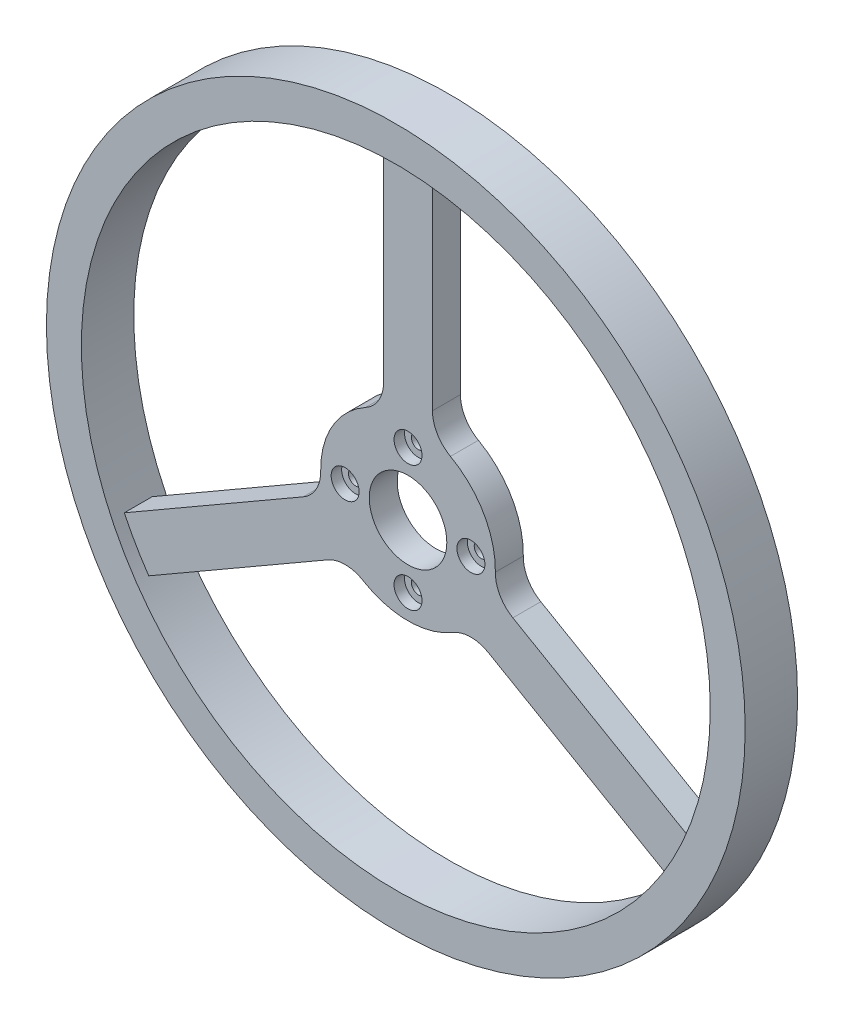
ISO-10303-21;
HEADER;
FILE_DESCRIPTION(('STEP AP214'),'2;1');
FILE_NAME('part.step','',(''),(''),'','','');
FILE_SCHEMA(('AUTOMOTIVE_DESIGN { 1 0 10303 214 1 1 1 1 }'));
ENDSEC;
DATA;
#1=APPLICATION_CONTEXT('core data for automotive mechanical design processes');
#2=APPLICATION_PROTOCOL_DEFINITION('international standard','automotive_design',2000,#1);
#3=PRODUCT_CONTEXT('',#1,'mechanical');
#4=PRODUCT('Part','Part','',(#3));
#5=PRODUCT_RELATED_PRODUCT_CATEGORY('part','',(#4));
#6=PRODUCT_DEFINITION_FORMATION('','',#4);
#7=PRODUCT_DEFINITION_CONTEXT('part definition',#1,'design');
#8=PRODUCT_DEFINITION('design','',#6,#7);
#9=PRODUCT_DEFINITION_SHAPE('','',#8);
#10=(LENGTH_UNIT() NAMED_UNIT(*) SI_UNIT(.MILLI.,.METRE.));
#11=(NAMED_UNIT(*) PLANE_ANGLE_UNIT() SI_UNIT($,.RADIAN.));
#12=(NAMED_UNIT(*) SI_UNIT($,.STERADIAN.) SOLID_ANGLE_UNIT());
#13=UNCERTAINTY_MEASURE_WITH_UNIT(LENGTH_MEASURE(1.E-05),#10,'distance_accuracy_value','');
#14=(GEOMETRIC_REPRESENTATION_CONTEXT(3) GLOBAL_UNCERTAINTY_ASSIGNED_CONTEXT((#13)) GLOBAL_UNIT_ASSIGNED_CONTEXT((#10,
#11,#12)) REPRESENTATION_CONTEXT('',''));
#15=CARTESIAN_POINT('',(0.,0.,0.));
#16=DIRECTION('',(0.,0.,1.));
#17=DIRECTION('',(1.,0.,0.));
#18=AXIS2_PLACEMENT_3D('',#15,#16,#17);
#19=CARTESIAN_POINT('',(-18.,0.,15.));
#20=DIRECTION('',(0.,0.,-1.));
#21=DIRECTION('',(-1.,0.,0.));
#22=AXIS2_PLACEMENT_3D('',#19,#20,#21);
#23=CYLINDRICAL_SURFACE('',#22,2.05);
#24=CARTESIAN_POINT('',(-18.,0.,3.5));
#25=DIRECTION('',(0.,0.,1.));
#26=DIRECTION('',(1.,0.,0.));
#27=AXIS2_PLACEMENT_3D('',#24,#25,#26);
#28=CIRCLE('',#27,2.05);
#29=CARTESIAN_POINT('',(-15.95,0.,3.5));
#30=VERTEX_POINT('',#29);
#31=EDGE_CURVE('E204',#30,#30,#28,.F.);
#32=ORIENTED_EDGE('',*,*,#31,.T.);
#33=EDGE_LOOP('',(#32));
#34=FACE_BOUND('',#33,.T.);
#35=CARTESIAN_POINT('',(-18.,0.,8.5));
#36=DIRECTION('',(0.,0.,1.));
#37=DIRECTION('',(1.,0.,0.));
#38=AXIS2_PLACEMENT_3D('',#35,#36,#37);
#39=CIRCLE('',#38,2.05);
#40=CARTESIAN_POINT('',(-15.95,0.,8.5));
#41=VERTEX_POINT('',#40);
#42=EDGE_CURVE('E44',#41,#41,#39,.T.);
#43=ORIENTED_EDGE('',*,*,#42,.T.);
#44=EDGE_LOOP('',(#43));
#45=FACE_BOUND('',#44,.T.);
#46=ADVANCED_FACE('F40',(#34,#45),#23,.F.);
#47=CARTESIAN_POINT('',(0.,-18.,15.));
#48=DIRECTION('',(0.,0.,-1.));
#49=DIRECTION('',(-1.,0.,0.));
#50=AXIS2_PLACEMENT_3D('',#47,#48,#49);
#51=CYLINDRICAL_SURFACE('',#50,2.05);
#52=CARTESIAN_POINT('',(0.,-18.,3.5));
#53=DIRECTION('',(0.,0.,1.));
#54=DIRECTION('',(1.,0.,0.));
#55=AXIS2_PLACEMENT_3D('',#52,#53,#54);
#56=CIRCLE('',#55,2.05);
#57=CARTESIAN_POINT('',(2.05,-18.,3.5));
#58=VERTEX_POINT('',#57);
#59=EDGE_CURVE('E207',#58,#58,#56,.F.);
#60=ORIENTED_EDGE('',*,*,#59,.T.);
#61=EDGE_LOOP('',(#60));
#62=FACE_BOUND('',#61,.T.);
#63=CARTESIAN_POINT('',(0.,-18.,8.5));
#64=DIRECTION('',(0.,0.,1.));
#65=DIRECTION('',(1.,0.,0.));
#66=AXIS2_PLACEMENT_3D('',#63,#64,#65);
#67=CIRCLE('',#66,2.05);
#68=CARTESIAN_POINT('',(2.05,-18.,8.5));
#69=VERTEX_POINT('',#68);
#70=EDGE_CURVE('E268',#69,#69,#67,.T.);
#71=ORIENTED_EDGE('',*,*,#70,.T.);
#72=EDGE_LOOP('',(#71));
#73=FACE_BOUND('',#72,.T.);
#74=ADVANCED_FACE('F442',(#62,#73),#51,.F.);
#75=CARTESIAN_POINT('',(18.,0.,15.));
#76=DIRECTION('',(0.,0.,-1.));
#77=DIRECTION('',(-1.,0.,0.));
#78=AXIS2_PLACEMENT_3D('',#75,#76,#77);
#79=CYLINDRICAL_SURFACE('',#78,2.05);
#80=CARTESIAN_POINT('',(18.,0.,3.5));
#81=DIRECTION('',(0.,0.,1.));
#82=DIRECTION('',(1.,0.,0.));
#83=AXIS2_PLACEMENT_3D('',#80,#81,#82);
#84=CIRCLE('',#83,2.05);
#85=CARTESIAN_POINT('',(20.05,0.,3.5));
#86=VERTEX_POINT('',#85);
#87=EDGE_CURVE('E210',#86,#86,#84,.F.);
#88=ORIENTED_EDGE('',*,*,#87,.T.);
#89=EDGE_LOOP('',(#88));
#90=FACE_BOUND('',#89,.T.);
#91=CARTESIAN_POINT('',(18.,0.,8.5));
#92=DIRECTION('',(0.,0.,1.));
#93=DIRECTION('',(1.,0.,0.));
#94=AXIS2_PLACEMENT_3D('',#91,#92,#93);
#95=CIRCLE('',#94,2.05);
#96=CARTESIAN_POINT('',(20.05,0.,8.5));
#97=VERTEX_POINT('',#96);
#98=EDGE_CURVE('E265',#97,#97,#95,.T.);
#99=ORIENTED_EDGE('',*,*,#98,.T.);
#100=EDGE_LOOP('',(#99));
#101=FACE_BOUND('',#100,.T.);
#102=ADVANCED_FACE('F448',(#90,#101),#79,.F.);
#103=CARTESIAN_POINT('',(0.,18.,15.));
#104=DIRECTION('',(0.,0.,-1.));
#105=DIRECTION('',(-1.,0.,0.));
#106=AXIS2_PLACEMENT_3D('',#103,#104,#105);
#107=CYLINDRICAL_SURFACE('',#106,2.05);
#108=CARTESIAN_POINT('',(0.,18.,3.5));
#109=DIRECTION('',(0.,0.,1.));
#110=DIRECTION('',(1.,0.,0.));
#111=AXIS2_PLACEMENT_3D('',#108,#109,#110);
#112=CIRCLE('',#111,2.05);
#113=CARTESIAN_POINT('',(2.05,18.,3.5));
#114=VERTEX_POINT('',#113);
#115=EDGE_CURVE('E203',#114,#114,#112,.F.);
#116=ORIENTED_EDGE('',*,*,#115,.T.);
#117=EDGE_LOOP('',(#116));
#118=FACE_BOUND('',#117,.T.);
#119=CARTESIAN_POINT('',(0.,18.,8.5));
#120=DIRECTION('',(0.,0.,1.));
#121=DIRECTION('',(1.,0.,0.));
#122=AXIS2_PLACEMENT_3D('',#119,#120,#121);
#123=CIRCLE('',#122,2.05);
#124=CARTESIAN_POINT('',(2.05,18.,8.5));
#125=VERTEX_POINT('',#124);
#126=EDGE_CURVE('E262',#125,#125,#123,.T.);
#127=ORIENTED_EDGE('',*,*,#126,.T.);
#128=EDGE_LOOP('',(#127));
#129=FACE_BOUND('',#128,.T.);
#130=ADVANCED_FACE('F466',(#118,#129),#107,.F.);
#131=CARTESIAN_POINT('',(0.,0.,11.5));
#132=DIRECTION('',(0.,0.,-1.));
#133=DIRECTION('',(-1.,0.,0.));
#134=AXIS2_PLACEMENT_3D('',#131,#132,#133);
#135=CYLINDRICAL_SURFACE('',#134,25.);
#136=CARTESIAN_POINT('',(0.,0.,3.5));
#137=DIRECTION('',(0.,0.,1.));
#138=DIRECTION('',(1.,0.,0.));
#139=AXIS2_PLACEMENT_3D('',#136,#137,#138);
#140=CIRCLE('',#139,25.);
#141=CARTESIAN_POINT('',(-12.1428571428571,21.8529407725405,3.5));
#142=VERTEX_POINT('',#141);
#143=CARTESIAN_POINT('',(-24.9966304278454,-0.410447626030762,3.5));
#144=VERTEX_POINT('',#143);
#145=EDGE_CURVE('E334',#142,#144,#140,.T.);
#146=ORIENTED_EDGE('',*,*,#145,.T.);
#147=DIRECTION('',(0.,0.,-1.));
#148=VECTOR('',#147,1.);
#149=CARTESIAN_POINT('',(-24.9966304278454,-0.410447626030762,11.5));
#150=LINE('',#149,#148);
#151=CARTESIAN_POINT('',(-24.9966304278454,-0.410447626030762,11.5));
#152=VERTEX_POINT('',#151);
#153=EDGE_CURVE('E238',#144,#152,#150,.F.);
#154=ORIENTED_EDGE('',*,*,#153,.T.);
#155=CARTESIAN_POINT('',(0.,0.,11.5));
#156=DIRECTION('',(0.,0.,1.));
#157=DIRECTION('',(1.,0.,0.));
#158=AXIS2_PLACEMENT_3D('',#155,#156,#157);
#159=CIRCLE('',#158,25.);
#160=CARTESIAN_POINT('',(-12.1428571428571,21.8529407725405,11.5));
#161=VERTEX_POINT('',#160);
#162=EDGE_CURVE('E328',#161,#152,#159,.T.);
#163=ORIENTED_EDGE('',*,*,#162,.F.);
#164=DIRECTION('',(0.,0.,-1.));
#165=VECTOR('',#164,1.);
#166=CARTESIAN_POINT('',(-12.1428571428571,21.8529407725405,11.5));
#167=LINE('',#166,#165);
#168=EDGE_CURVE('E235',#161,#142,#167,.T.);
#169=ORIENTED_EDGE('',*,*,#168,.T.);
#170=EDGE_LOOP('',(#146,#154,#163,#169));
#171=FACE_BOUND('',#170,.T.);
#172=ADVANCED_FACE('F376',(#171),#135,.T.);
#173=CARTESIAN_POINT('',(-12.8537732849881,-21.4424931465099,3.5));
#174=VERTEX_POINT('',#173);
#175=CARTESIAN_POINT('',(12.8537732849881,-21.4424931465099,3.5));
#176=VERTEX_POINT('',#175);
#177=EDGE_CURVE('E337',#174,#176,#140,.T.);
#178=ORIENTED_EDGE('',*,*,#177,.T.);
#179=DIRECTION('',(0.,0.,-1.));
#180=VECTOR('',#179,1.);
#181=CARTESIAN_POINT('',(12.8537732849881,-21.4424931465099,11.5));
#182=LINE('',#181,#180);
#183=CARTESIAN_POINT('',(12.8537732849881,-21.4424931465099,11.5));
#184=VERTEX_POINT('',#183);
#185=EDGE_CURVE('E230',#176,#184,#182,.F.);
#186=ORIENTED_EDGE('',*,*,#185,.T.);
#187=CARTESIAN_POINT('',(-12.8537732849881,-21.4424931465099,11.5));
#188=VERTEX_POINT('',#187);
#189=EDGE_CURVE('E332',#188,#184,#159,.T.);
#190=ORIENTED_EDGE('',*,*,#189,.F.);
#191=DIRECTION('',(0.,0.,-1.));
#192=VECTOR('',#191,1.);
#193=CARTESIAN_POINT('',(-12.8537732849881,-21.4424931465099,11.5));
#194=LINE('',#193,#192);
#195=EDGE_CURVE('E227',#188,#174,#194,.T.);
#196=ORIENTED_EDGE('',*,*,#195,.T.);
#197=EDGE_LOOP('',(#178,#186,#190,#196));
#198=FACE_BOUND('',#197,.T.);
#199=ADVANCED_FACE('F394',(#198),#135,.T.);
#200=CARTESIAN_POINT('',(0.,0.,15.));
#201=DIRECTION('',(0.,0.,-1.));
#202=DIRECTION('',(-1.,0.,0.));
#203=AXIS2_PLACEMENT_3D('',#200,#201,#202);
#204=CYLINDRICAL_SURFACE('',#203,90.);
#205=CARTESIAN_POINT('',(0.,0.,11.5));
#206=DIRECTION('',(0.,0.,1.));
#207=DIRECTION('',(1.,0.,0.));
#208=AXIS2_PLACEMENT_3D('',#205,#206,#207);
#209=CIRCLE('',#208,90.);
#210=CARTESIAN_POINT('',(74.2061773606189,-50.9258602433417,11.5));
#211=VERTEX_POINT('',#210);
#212=CARTESIAN_POINT('',(81.206177360619,-38.8015045903596,11.5));
#213=VERTEX_POINT('',#212);
#214=EDGE_CURVE('E319',#211,#213,#209,.T.);
#215=ORIENTED_EDGE('',*,*,#214,.F.);
#216=DIRECTION('',(0.,0.,-1.));
#217=VECTOR('',#216,1.);
#218=CARTESIAN_POINT('',(74.2061773606189,-50.9258602433417,15.));
#219=LINE('',#218,#217);
#220=CARTESIAN_POINT('',(74.2061773606189,-50.9258602433417,3.5));
#221=VERTEX_POINT('',#220);
#222=EDGE_CURVE('E324',#211,#221,#219,.T.);
#223=ORIENTED_EDGE('',*,*,#222,.T.);
#224=CARTESIAN_POINT('',(0.,0.,3.5));
#225=DIRECTION('',(0.,0.,1.));
#226=DIRECTION('',(1.,0.,0.));
#227=AXIS2_PLACEMENT_3D('',#224,#225,#226);
#228=CIRCLE('',#227,90.);
#229=CARTESIAN_POINT('',(81.206177360619,-38.8015045903596,3.5));
#230=VERTEX_POINT('',#229);
#231=EDGE_CURVE('E313',#221,#230,#228,.T.);
#232=ORIENTED_EDGE('',*,*,#231,.T.);
#233=DIRECTION('',(0.,0.,-1.));
#234=VECTOR('',#233,1.);
#235=CARTESIAN_POINT('',(81.206177360619,-38.8015045903596,15.));
#236=LINE('',#235,#234);
#237=EDGE_CURVE('E321',#230,#213,#236,.F.);
#238=ORIENTED_EDGE('',*,*,#237,.T.);
#239=EDGE_LOOP('',(#215,#223,#232,#238));
#240=FACE_BOUND('',#239,.T.);
#241=CARTESIAN_POINT('',(0.,0.,11.5));
#242=DIRECTION('',(0.,0.,1.));
#243=DIRECTION('',(1.,0.,0.));
#244=AXIS2_PLACEMENT_3D('',#241,#242,#243);
#245=CIRCLE('',#244,90.);
#246=CARTESIAN_POINT('',(7.00000000000001,89.7273648337005,11.5));
#247=VERTEX_POINT('',#246);
#248=CARTESIAN_POINT('',(-7.,89.7273648337005,11.5));
#249=VERTEX_POINT('',#248);
#250=EDGE_CURVE('E191',#247,#249,#245,.T.);
#251=ORIENTED_EDGE('',*,*,#250,.F.);
#252=DIRECTION('',(0.,0.,-1.));
#253=VECTOR('',#252,1.);
#254=CARTESIAN_POINT('',(7.00000000000001,89.7273648337005,15.));
#255=LINE('',#254,#253);
#256=CARTESIAN_POINT('',(7.00000000000001,89.7273648337005,3.5));
#257=VERTEX_POINT('',#256);
#258=EDGE_CURVE('E360',#247,#257,#255,.T.);
#259=ORIENTED_EDGE('',*,*,#258,.T.);
#260=CARTESIAN_POINT('',(0.,0.,3.5));
#261=DIRECTION('',(0.,0.,1.));
#262=DIRECTION('',(1.,0.,0.));
#263=AXIS2_PLACEMENT_3D('',#260,#261,#262);
#264=CIRCLE('',#263,90.);
#265=CARTESIAN_POINT('',(-7.,89.7273648337005,3.5));
#266=VERTEX_POINT('',#265);
#267=EDGE_CURVE('E355',#257,#266,#264,.T.);
#268=ORIENTED_EDGE('',*,*,#267,.T.);
#269=DIRECTION('',(0.,0.,-1.));
#270=VECTOR('',#269,1.);
#271=CARTESIAN_POINT('',(-7.,89.7273648337005,15.));
#272=LINE('',#271,#270);
#273=EDGE_CURVE('E195',#266,#249,#272,.F.);
#274=ORIENTED_EDGE('',*,*,#273,.T.);
#275=EDGE_LOOP('',(#251,#259,#268,#274));
#276=FACE_BOUND('',#275,.T.);
#277=CARTESIAN_POINT('',(0.,0.,15.));
#278=DIRECTION('',(0.,0.,1.));
#279=DIRECTION('',(1.,0.,0.));
#280=AXIS2_PLACEMENT_3D('',#277,#278,#279);
#281=CIRCLE('',#280,90.);
#282=CARTESIAN_POINT('',(90.,0.,15.));
#283=VERTEX_POINT('',#282);
#284=EDGE_CURVE('E346',#283,#283,#281,.T.);
#285=ORIENTED_EDGE('',*,*,#284,.T.);
#286=EDGE_LOOP('',(#285));
#287=FACE_BOUND('',#286,.T.);
#288=CARTESIAN_POINT('',(0.,0.,0.));
#289=DIRECTION('',(0.,0.,1.));
#290=DIRECTION('',(1.,0.,0.));
#291=AXIS2_PLACEMENT_3D('',#288,#289,#290);
#292=CIRCLE('',#291,90.);
#293=CARTESIAN_POINT('',(90.,0.,0.));
#294=VERTEX_POINT('',#293);
#295=EDGE_CURVE('E343',#294,#294,#292,.T.);
#296=ORIENTED_EDGE('',*,*,#295,.F.);
#297=EDGE_LOOP('',(#296));
#298=FACE_BOUND('',#297,.T.);
#299=DIRECTION('',(0.,0.,-1.));
#300=VECTOR('',#299,1.);
#301=CARTESIAN_POINT('',(-74.2061773606189,-50.9258602433417,15.));
#302=LINE('',#301,#300);
#303=CARTESIAN_POINT('',(-74.2061773606189,-50.9258602433417,3.5));
#304=VERTEX_POINT('',#303);
#305=CARTESIAN_POINT('',(-74.2061773606189,-50.9258602433417,11.5));
#306=VERTEX_POINT('',#305);
#307=EDGE_CURVE('E175',#304,#306,#302,.F.);
#308=ORIENTED_EDGE('',*,*,#307,.T.);
#309=CARTESIAN_POINT('',(0.,0.,11.5));
#310=DIRECTION('',(0.,0.,-1.));
#311=DIRECTION('',(-1.,0.,0.));
#312=AXIS2_PLACEMENT_3D('',#309,#310,#311);
#313=CIRCLE('',#312,90.);
#314=CARTESIAN_POINT('',(-81.206177360619,-38.8015045903596,11.5));
#315=VERTEX_POINT('',#314);
#316=EDGE_CURVE('E184',#306,#315,#313,.T.);
#317=ORIENTED_EDGE('',*,*,#316,.T.);
#318=DIRECTION('',(0.,0.,-1.));
#319=VECTOR('',#318,1.);
#320=CARTESIAN_POINT('',(-81.206177360619,-38.8015045903596,15.));
#321=LINE('',#320,#319);
#322=CARTESIAN_POINT('',(-81.206177360619,-38.8015045903596,3.5));
#323=VERTEX_POINT('',#322);
#324=EDGE_CURVE('E171',#315,#323,#321,.T.);
#325=ORIENTED_EDGE('',*,*,#324,.T.);
#326=CARTESIAN_POINT('',(0.,0.,3.5));
#327=DIRECTION('',(0.,0.,-1.));
#328=DIRECTION('',(-1.,0.,0.));
#329=AXIS2_PLACEMENT_3D('',#326,#327,#328);
#330=CIRCLE('',#329,90.);
#331=EDGE_CURVE('E181',#304,#323,#330,.T.);
#332=ORIENTED_EDGE('',*,*,#331,.F.);
#333=EDGE_LOOP('',(#308,#317,#325,#332));
#334=FACE_BOUND('',#333,.T.);
#335=ADVANCED_FACE('F180',(#240,#276,#287,#298,#334),#204,.F.);
#336=CARTESIAN_POINT('',(24.9966304278454,-0.41044762603079,3.5));
#337=VERTEX_POINT('',#336);
#338=CARTESIAN_POINT('',(12.1428571428571,21.8529407725405,3.5));
#339=VERTEX_POINT('',#338);
#340=EDGE_CURVE('E327',#337,#339,#140,.T.);
#341=ORIENTED_EDGE('',*,*,#340,.T.);
#342=DIRECTION('',(0.,0.,-1.));
#343=VECTOR('',#342,1.);
#344=CARTESIAN_POINT('',(12.1428571428571,21.8529407725405,11.5));
#345=LINE('',#344,#343);
#346=CARTESIAN_POINT('',(12.1428571428571,21.8529407725405,11.5));
#347=VERTEX_POINT('',#346);
#348=EDGE_CURVE('E220',#339,#347,#345,.F.);
#349=ORIENTED_EDGE('',*,*,#348,.T.);
#350=CARTESIAN_POINT('',(24.9966304278454,-0.41044762603079,11.5));
#351=VERTEX_POINT('',#350);
#352=EDGE_CURVE('E333',#351,#347,#159,.T.);
#353=ORIENTED_EDGE('',*,*,#352,.F.);
#354=DIRECTION('',(0.,0.,-1.));
#355=VECTOR('',#354,1.);
#356=CARTESIAN_POINT('',(24.9966304278454,-0.41044762603079,11.5));
#357=LINE('',#356,#355);
#358=EDGE_CURVE('E217',#351,#337,#357,.T.);
#359=ORIENTED_EDGE('',*,*,#358,.T.);
#360=EDGE_LOOP('',(#341,#349,#353,#359));
#361=FACE_BOUND('',#360,.T.);
#362=ADVANCED_FACE('F413',(#361),#135,.T.);
#363=CARTESIAN_POINT('',(0.,0.,15.));
#364=DIRECTION('',(0.,0.,-1.));
#365=DIRECTION('',(-1.,0.,0.));
#366=AXIS2_PLACEMENT_3D('',#363,#364,#365);
#367=CYLINDRICAL_SURFACE('',#366,100.);
#368=CARTESIAN_POINT('',(0.,0.,15.));
#369=DIRECTION('',(0.,0.,1.));
#370=DIRECTION('',(1.,0.,0.));
#371=AXIS2_PLACEMENT_3D('',#368,#369,#370);
#372=CIRCLE('',#371,100.);
#373=CARTESIAN_POINT('',(100.,0.,15.));
#374=VERTEX_POINT('',#373);
#375=EDGE_CURVE('E352',#374,#374,#372,.T.);
#376=ORIENTED_EDGE('',*,*,#375,.F.);
#377=EDGE_LOOP('',(#376));
#378=FACE_BOUND('',#377,.T.);
#379=CARTESIAN_POINT('',(0.,0.,0.));
#380=DIRECTION('',(0.,0.,1.));
#381=DIRECTION('',(1.,0.,0.));
#382=AXIS2_PLACEMENT_3D('',#379,#380,#381);
#383=CIRCLE('',#382,100.);
#384=CARTESIAN_POINT('',(100.,0.,0.));
#385=VERTEX_POINT('',#384);
#386=EDGE_CURVE('E349',#385,#385,#383,.T.);
#387=ORIENTED_EDGE('',*,*,#386,.T.);
#388=EDGE_LOOP('',(#387));
#389=FACE_BOUND('',#388,.T.);
#390=ADVANCED_FACE('F483',(#378,#389),#367,.T.);
#391=CARTESIAN_POINT('',(0.,0.,15.));
#392=DIRECTION('',(0.,0.,1.));
#393=DIRECTION('',(1.,0.,0.));
#394=AXIS2_PLACEMENT_3D('',#391,#392,#393);
#395=PLANE('',#394);
#396=ORIENTED_EDGE('',*,*,#284,.F.);
#397=EDGE_LOOP('',(#396));
#398=FACE_BOUND('',#397,.T.);
#399=ORIENTED_EDGE('',*,*,#375,.T.);
#400=EDGE_LOOP('',(#399));
#401=FACE_BOUND('',#400,.T.);
#402=ADVANCED_FACE('F480',(#398,#401),#395,.T.);
#403=CARTESIAN_POINT('',(0.,0.,0.));
#404=DIRECTION('',(0.,0.,1.));
#405=DIRECTION('',(1.,0.,0.));
#406=AXIS2_PLACEMENT_3D('',#403,#404,#405);
#407=PLANE('',#406);
#408=ORIENTED_EDGE('',*,*,#295,.T.);
#409=EDGE_LOOP('',(#408));
#410=FACE_BOUND('',#409,.T.);
#411=ORIENTED_EDGE('',*,*,#386,.F.);
#412=EDGE_LOOP('',(#411));
#413=FACE_BOUND('',#412,.T.);
#414=ADVANCED_FACE('F469',(#410,#413),#407,.F.);
#415=CARTESIAN_POINT('',(0.,0.,11.5));
#416=DIRECTION('',(0.,0.,1.));
#417=DIRECTION('',(1.,0.,0.));
#418=AXIS2_PLACEMENT_3D('',#415,#416,#417);
#419=PLANE('',#418);
#420=CARTESIAN_POINT('',(18.,0.,11.5));
#421=DIRECTION('',(0.,0.,1.));
#422=DIRECTION('',(1.,0.,0.));
#423=AXIS2_PLACEMENT_3D('',#420,#421,#422);
#424=CIRCLE('',#423,4.);
#425=CARTESIAN_POINT('',(22.,0.,11.5));
#426=VERTEX_POINT('',#425);
#427=EDGE_CURVE('E800',#426,#426,#424,.T.);
#428=ORIENTED_EDGE('',*,*,#427,.F.);
#429=EDGE_LOOP('',(#428));
#430=FACE_BOUND('',#429,.T.);
#431=CARTESIAN_POINT('',(0.,-18.,11.5));
#432=DIRECTION('',(0.,0.,1.));
#433=DIRECTION('',(1.,0.,0.));
#434=AXIS2_PLACEMENT_3D('',#431,#432,#433);
#435=CIRCLE('',#434,4.);
#436=CARTESIAN_POINT('',(4.,-18.,11.5));
#437=VERTEX_POINT('',#436);
#438=EDGE_CURVE('E798',#437,#437,#435,.T.);
#439=ORIENTED_EDGE('',*,*,#438,.F.);
#440=EDGE_LOOP('',(#439));
#441=FACE_BOUND('',#440,.T.);
#442=CARTESIAN_POINT('',(-18.,0.,11.5));
#443=DIRECTION('',(0.,0.,1.));
#444=DIRECTION('',(1.,0.,0.));
#445=AXIS2_PLACEMENT_3D('',#442,#443,#444);
#446=CIRCLE('',#445,4.);
#447=CARTESIAN_POINT('',(-14.,0.,11.5));
#448=VERTEX_POINT('',#447);
#449=EDGE_CURVE('E285',#448,#448,#446,.T.);
#450=ORIENTED_EDGE('',*,*,#449,.F.);
#451=EDGE_LOOP('',(#450));
#452=FACE_BOUND('',#451,.T.);
#453=CARTESIAN_POINT('',(0.,18.,11.5));
#454=DIRECTION('',(0.,0.,1.));
#455=DIRECTION('',(1.,0.,0.));
#456=AXIS2_PLACEMENT_3D('',#453,#454,#455);
#457=CIRCLE('',#456,4.);
#458=CARTESIAN_POINT('',(4.,18.,11.5));
#459=VERTEX_POINT('',#458);
#460=EDGE_CURVE('E286',#459,#459,#457,.T.);
#461=ORIENTED_EDGE('',*,*,#460,.F.);
#462=EDGE_LOOP('',(#461));
#463=FACE_BOUND('',#462,.T.);
#464=CARTESIAN_POINT('',(0.,0.,11.5));
#465=DIRECTION('',(0.,0.,1.));
#466=DIRECTION('',(1.,0.,0.));
#467=AXIS2_PLACEMENT_3D('',#464,#465,#466);
#468=CIRCLE('',#467,11.1);
#469=CARTESIAN_POINT('',(11.1,0.,11.5));
#470=VERTEX_POINT('',#469);
#471=EDGE_CURVE('E202',#470,#470,#468,.F.);
#472=ORIENTED_EDGE('',*,*,#471,.T.);
#473=EDGE_LOOP('',(#472));
#474=FACE_BOUND('',#473,.T.);
#475=DIRECTION('',(0.,-1.,0.));
#476=VECTOR('',#475,1.);
#477=CARTESIAN_POINT('',(-7.,94.,11.5));
#478=LINE('',#477,#476);
#479=CARTESIAN_POINT('',(-6.99999999999999,30.5941170815567,11.5));
#480=VERTEX_POINT('',#479);
#481=EDGE_CURVE('E338',#249,#480,#478,.T.);
#482=ORIENTED_EDGE('',*,*,#481,.T.);
#483=CARTESIAN_POINT('',(-17.,30.5941170815567,11.5));
#484=DIRECTION('',(0.,0.,1.));
#485=DIRECTION('',(1.,0.,0.));
#486=AXIS2_PLACEMENT_3D('',#483,#484,#485);
#487=CIRCLE('',#486,10.);
#488=EDGE_CURVE('E11',#480,#161,#487,.F.);
#489=ORIENTED_EDGE('',*,*,#488,.T.);
#490=ORIENTED_EDGE('',*,*,#162,.T.);
#491=CARTESIAN_POINT('',(-34.9952825989835,-0.574626676443066,11.5));
#492=DIRECTION('',(0.,0.,1.));
#493=DIRECTION('',(1.,0.,0.));
#494=AXIS2_PLACEMENT_3D('',#491,#492,#493);
#495=CIRCLE('',#494,10.);
#496=CARTESIAN_POINT('',(-29.9952825989835,-9.23488071428743,11.5));
#497=VERTEX_POINT('',#496);
#498=EDGE_CURVE('E259',#152,#497,#495,.F.);
#499=ORIENTED_EDGE('',*,*,#498,.T.);
#500=DIRECTION('',(-0.866025403784436,-0.500000000000004,0.));
#501=VECTOR('',#500,1.);
#502=CARTESIAN_POINT('',(-84.9063879557371,-40.9378221735094,11.5));
#503=LINE('',#502,#501);
#504=EDGE_CURVE('E301',#497,#315,#503,.T.);
#505=ORIENTED_EDGE('',*,*,#504,.T.);
#506=ORIENTED_EDGE('',*,*,#316,.F.);
#507=DIRECTION('',(0.866025403784436,0.500000000000004,0.));
#508=VECTOR('',#507,1.);
#509=CARTESIAN_POINT('',(-17.2846096908264,-18.0621778264911,11.5));
#510=LINE('',#509,#508);
#511=CARTESIAN_POINT('',(-22.9952825989834,-21.3592363672695,11.5));
#512=VERTEX_POINT('',#511);
#513=EDGE_CURVE('E300',#306,#512,#510,.T.);
#514=ORIENTED_EDGE('',*,*,#513,.T.);
#515=CARTESIAN_POINT('',(-17.9952825989834,-30.0194904051139,11.5));
#516=DIRECTION('',(0.,0.,1.));
#517=DIRECTION('',(1.,0.,0.));
#518=AXIS2_PLACEMENT_3D('',#515,#516,#517);
#519=CIRCLE('',#518,10.);
#520=EDGE_CURVE('E255',#512,#188,#519,.F.);
#521=ORIENTED_EDGE('',*,*,#520,.T.);
#522=ORIENTED_EDGE('',*,*,#189,.T.);
#523=CARTESIAN_POINT('',(17.9952825989834,-30.0194904051139,11.5));
#524=DIRECTION('',(0.,0.,1.));
#525=DIRECTION('',(1.,0.,0.));
#526=AXIS2_PLACEMENT_3D('',#523,#524,#525);
#527=CIRCLE('',#526,10.);
#528=CARTESIAN_POINT('',(22.9952825989834,-21.3592363672695,11.5));
#529=VERTEX_POINT('',#528);
#530=EDGE_CURVE('E251',#184,#529,#527,.F.);
#531=ORIENTED_EDGE('',*,*,#530,.T.);
#532=DIRECTION('',(0.866025403784436,-0.500000000000004,0.));
#533=VECTOR('',#532,1.);
#534=CARTESIAN_POINT('',(17.2846096908264,-18.0621778264912,11.5));
#535=LINE('',#534,#533);
#536=EDGE_CURVE('E311',#529,#211,#535,.T.);
#537=ORIENTED_EDGE('',*,*,#536,.T.);
#538=ORIENTED_EDGE('',*,*,#214,.T.);
#539=DIRECTION('',(-0.866025403784436,0.500000000000004,0.));
#540=VECTOR('',#539,1.);
#541=CARTESIAN_POINT('',(84.906387955737,-40.9378221735093,11.5));
#542=LINE('',#541,#540);
#543=CARTESIAN_POINT('',(29.9952825989835,-9.23488071428748,11.5));
#544=VERTEX_POINT('',#543);
#545=EDGE_CURVE('E185',#213,#544,#542,.T.);
#546=ORIENTED_EDGE('',*,*,#545,.T.);
#547=CARTESIAN_POINT('',(34.9952825989835,-0.574626676443106,11.5));
#548=DIRECTION('',(0.,0.,1.));
#549=DIRECTION('',(1.,0.,0.));
#550=AXIS2_PLACEMENT_3D('',#547,#548,#549);
#551=CIRCLE('',#550,10.);
#552=EDGE_CURVE('E247',#544,#351,#551,.F.);
#553=ORIENTED_EDGE('',*,*,#552,.T.);
#554=ORIENTED_EDGE('',*,*,#352,.T.);
#555=CARTESIAN_POINT('',(17.,30.5941170815567,11.5));
#556=DIRECTION('',(0.,0.,1.));
#557=DIRECTION('',(1.,0.,0.));
#558=AXIS2_PLACEMENT_3D('',#555,#556,#557);
#559=CIRCLE('',#558,10.);
#560=CARTESIAN_POINT('',(7.00000000000001,30.5941170815567,11.5));
#561=VERTEX_POINT('',#560);
#562=EDGE_CURVE('E243',#347,#561,#559,.F.);
#563=ORIENTED_EDGE('',*,*,#562,.T.);
#564=DIRECTION('',(0.,1.,0.));
#565=VECTOR('',#564,1.);
#566=CARTESIAN_POINT('',(7.00000000000001,24.,11.5));
#567=LINE('',#566,#565);
#568=EDGE_CURVE('E340',#561,#247,#567,.T.);
#569=ORIENTED_EDGE('',*,*,#568,.T.);
#570=ORIENTED_EDGE('',*,*,#250,.T.);
#571=EDGE_LOOP('',(#482,#489,#490,#499,#505,#506,#514,#521,#522,#531,#537,#538,#546,#553,#554,
#563,#569,#570));
#572=FACE_BOUND('',#571,.T.);
#573=ADVANCED_FACE('F371',(#430,#441,#452,#463,#474,#572),#419,.T.);
#574=CARTESIAN_POINT('',(0.,0.,3.5));
#575=DIRECTION('',(0.,0.,1.));
#576=DIRECTION('',(1.,0.,0.));
#577=AXIS2_PLACEMENT_3D('',#574,#575,#576);
#578=PLANE('',#577);
#579=ORIENTED_EDGE('',*,*,#115,.F.);
#580=EDGE_LOOP('',(#579));
#581=FACE_BOUND('',#580,.T.);
#582=ORIENTED_EDGE('',*,*,#87,.F.);
#583=EDGE_LOOP('',(#582));
#584=FACE_BOUND('',#583,.T.);
#585=ORIENTED_EDGE('',*,*,#59,.F.);
#586=EDGE_LOOP('',(#585));
#587=FACE_BOUND('',#586,.T.);
#588=ORIENTED_EDGE('',*,*,#31,.F.);
#589=EDGE_LOOP('',(#588));
#590=FACE_BOUND('',#589,.T.);
#591=CARTESIAN_POINT('',(0.,0.,3.5));
#592=DIRECTION('',(0.,0.,1.));
#593=DIRECTION('',(1.,0.,0.));
#594=AXIS2_PLACEMENT_3D('',#591,#592,#593);
#595=CIRCLE('',#594,11.1);
#596=CARTESIAN_POINT('',(11.1,0.,3.5));
#597=VERTEX_POINT('',#596);
#598=EDGE_CURVE('E199',#597,#597,#595,.F.);
#599=ORIENTED_EDGE('',*,*,#598,.F.);
#600=EDGE_LOOP('',(#599));
#601=FACE_BOUND('',#600,.T.);
#602=ORIENTED_EDGE('',*,*,#177,.F.);
#603=CARTESIAN_POINT('',(-17.9952825989834,-30.0194904051139,3.5));
#604=DIRECTION('',(0.,0.,1.));
#605=DIRECTION('',(1.,0.,0.));
#606=AXIS2_PLACEMENT_3D('',#603,#604,#605);
#607=CIRCLE('',#606,10.);
#608=CARTESIAN_POINT('',(-22.9952825989834,-21.3592363672695,3.5));
#609=VERTEX_POINT('',#608);
#610=EDGE_CURVE('E253',#174,#609,#607,.T.);
#611=ORIENTED_EDGE('',*,*,#610,.T.);
#612=DIRECTION('',(0.866025403784436,0.500000000000004,0.));
#613=VECTOR('',#612,1.);
#614=CARTESIAN_POINT('',(-17.2846096908264,-18.0621778264911,3.5));
#615=LINE('',#614,#613);
#616=EDGE_CURVE('E176',#304,#609,#615,.T.);
#617=ORIENTED_EDGE('',*,*,#616,.F.);
#618=ORIENTED_EDGE('',*,*,#331,.T.);
#619=DIRECTION('',(-0.866025403784436,-0.500000000000004,0.));
#620=VECTOR('',#619,1.);
#621=CARTESIAN_POINT('',(-84.9063879557371,-40.9378221735094,3.5));
#622=LINE('',#621,#620);
#623=CARTESIAN_POINT('',(-29.9952825989835,-9.23488071428743,3.5));
#624=VERTEX_POINT('',#623);
#625=EDGE_CURVE('E167',#624,#323,#622,.T.);
#626=ORIENTED_EDGE('',*,*,#625,.F.);
#627=CARTESIAN_POINT('',(-34.9952825989835,-0.574626676443066,3.5));
#628=DIRECTION('',(0.,0.,1.));
#629=DIRECTION('',(1.,0.,0.));
#630=AXIS2_PLACEMENT_3D('',#627,#628,#629);
#631=CIRCLE('',#630,10.);
#632=EDGE_CURVE('E257',#624,#144,#631,.T.);
#633=ORIENTED_EDGE('',*,*,#632,.T.);
#634=ORIENTED_EDGE('',*,*,#145,.F.);
#635=CARTESIAN_POINT('',(-17.,30.5941170815567,3.5));
#636=DIRECTION('',(0.,0.,1.));
#637=DIRECTION('',(1.,0.,0.));
#638=AXIS2_PLACEMENT_3D('',#635,#636,#637);
#639=CIRCLE('',#638,10.);
#640=CARTESIAN_POINT('',(-6.99999999999999,30.5941170815567,3.5));
#641=VERTEX_POINT('',#640);
#642=EDGE_CURVE('E49',#142,#641,#639,.T.);
#643=ORIENTED_EDGE('',*,*,#642,.T.);
#644=DIRECTION('',(0.,-1.,0.));
#645=VECTOR('',#644,1.);
#646=CARTESIAN_POINT('',(-7.,94.,3.5));
#647=LINE('',#646,#645);
#648=EDGE_CURVE('E331',#266,#641,#647,.T.);
#649=ORIENTED_EDGE('',*,*,#648,.F.);
#650=ORIENTED_EDGE('',*,*,#267,.F.);
#651=DIRECTION('',(0.,1.,0.));
#652=VECTOR('',#651,1.);
#653=CARTESIAN_POINT('',(7.00000000000001,24.,3.5));
#654=LINE('',#653,#652);
#655=CARTESIAN_POINT('',(7.00000000000001,30.5941170815567,3.5));
#656=VERTEX_POINT('',#655);
#657=EDGE_CURVE('E341',#656,#257,#654,.T.);
#658=ORIENTED_EDGE('',*,*,#657,.F.);
#659=CARTESIAN_POINT('',(17.,30.5941170815567,3.5));
#660=DIRECTION('',(0.,0.,1.));
#661=DIRECTION('',(1.,0.,0.));
#662=AXIS2_PLACEMENT_3D('',#659,#660,#661);
#663=CIRCLE('',#662,10.);
#664=EDGE_CURVE('E241',#656,#339,#663,.T.);
#665=ORIENTED_EDGE('',*,*,#664,.T.);
#666=ORIENTED_EDGE('',*,*,#340,.F.);
#667=CARTESIAN_POINT('',(34.9952825989835,-0.574626676443106,3.5));
#668=DIRECTION('',(0.,0.,1.));
#669=DIRECTION('',(1.,0.,0.));
#670=AXIS2_PLACEMENT_3D('',#667,#668,#669);
#671=CIRCLE('',#670,10.);
#672=CARTESIAN_POINT('',(29.9952825989835,-9.23488071428748,3.5));
#673=VERTEX_POINT('',#672);
#674=EDGE_CURVE('E245',#337,#673,#671,.T.);
#675=ORIENTED_EDGE('',*,*,#674,.T.);
#676=DIRECTION('',(-0.866025403784436,0.500000000000004,0.));
#677=VECTOR('',#676,1.);
#678=CARTESIAN_POINT('',(84.906387955737,-40.9378221735093,3.5));
#679=LINE('',#678,#677);
#680=EDGE_CURVE('E307',#230,#673,#679,.T.);
#681=ORIENTED_EDGE('',*,*,#680,.F.);
#682=ORIENTED_EDGE('',*,*,#231,.F.);
#683=DIRECTION('',(0.866025403784436,-0.500000000000004,0.));
#684=VECTOR('',#683,1.);
#685=CARTESIAN_POINT('',(17.2846096908264,-18.0621778264912,3.5));
#686=LINE('',#685,#684);
#687=CARTESIAN_POINT('',(22.9952825989834,-21.3592363672695,3.5));
#688=VERTEX_POINT('',#687);
#689=EDGE_CURVE('E310',#688,#221,#686,.T.);
#690=ORIENTED_EDGE('',*,*,#689,.F.);
#691=CARTESIAN_POINT('',(17.9952825989834,-30.0194904051139,3.5));
#692=DIRECTION('',(0.,0.,1.));
#693=DIRECTION('',(1.,0.,0.));
#694=AXIS2_PLACEMENT_3D('',#691,#692,#693);
#695=CIRCLE('',#694,10.);
#696=EDGE_CURVE('E249',#688,#176,#695,.T.);
#697=ORIENTED_EDGE('',*,*,#696,.T.);
#698=EDGE_LOOP('',(#602,#611,#617,#618,#626,#633,#634,#643,#649,#650,#658,#665,#666,#675,#681,
#682,#690,#697));
#699=FACE_BOUND('',#698,.T.);
#700=ADVANCED_FACE('F189',(#581,#584,#587,#590,#601,#699),#578,.F.);
#701=CARTESIAN_POINT('',(-7.,94.,11.5));
#702=DIRECTION('',(1.,0.,0.));
#703=DIRECTION('',(0.,1.,0.));
#704=AXIS2_PLACEMENT_3D('',#701,#702,#703);
#705=PLANE('',#704);
#706=ORIENTED_EDGE('',*,*,#648,.T.);
#707=DIRECTION('',(0.,0.,1.));
#708=VECTOR('',#707,1.);
#709=CARTESIAN_POINT('',(-6.99999999999999,30.5941170815567,11.5));
#710=LINE('',#709,#708);
#711=EDGE_CURVE('E57',#641,#480,#710,.T.);
#712=ORIENTED_EDGE('',*,*,#711,.T.);
#713=ORIENTED_EDGE('',*,*,#481,.F.);
#714=ORIENTED_EDGE('',*,*,#273,.F.);
#715=EDGE_LOOP('',(#706,#712,#713,#714));
#716=FACE_BOUND('',#715,.T.);
#717=ADVANCED_FACE('F368',(#716),#705,.F.);
#718=CARTESIAN_POINT('',(7.00000000000001,24.,11.5));
#719=DIRECTION('',(-1.,0.,0.));
#720=DIRECTION('',(0.,-1.,0.));
#721=AXIS2_PLACEMENT_3D('',#718,#719,#720);
#722=PLANE('',#721);
#723=ORIENTED_EDGE('',*,*,#568,.F.);
#724=DIRECTION('',(0.,0.,1.));
#725=VECTOR('',#724,1.);
#726=CARTESIAN_POINT('',(7.00000000000001,30.5941170815567,3.5));
#727=LINE('',#726,#725);
#728=EDGE_CURVE('E193',#561,#656,#727,.F.);
#729=ORIENTED_EDGE('',*,*,#728,.T.);
#730=ORIENTED_EDGE('',*,*,#657,.T.);
#731=ORIENTED_EDGE('',*,*,#258,.F.);
#732=EDGE_LOOP('',(#723,#729,#730,#731));
#733=FACE_BOUND('',#732,.T.);
#734=ADVANCED_FACE('F409',(#733),#722,.F.);
#735=CARTESIAN_POINT('',(17.2846096908264,-18.0621778264912,11.5));
#736=DIRECTION('',(0.500000000000004,0.866025403784436,0.));
#737=DIRECTION('',(-0.866025403784436,0.500000000000004,0.));
#738=AXIS2_PLACEMENT_3D('',#735,#736,#737);
#739=PLANE('',#738);
#740=ORIENTED_EDGE('',*,*,#536,.F.);
#741=DIRECTION('',(0.,0.,1.));
#742=VECTOR('',#741,1.);
#743=CARTESIAN_POINT('',(22.9952825989834,-21.3592363672695,3.5));
#744=LINE('',#743,#742);
#745=EDGE_CURVE('E224',#529,#688,#744,.F.);
#746=ORIENTED_EDGE('',*,*,#745,.T.);
#747=ORIENTED_EDGE('',*,*,#689,.T.);
#748=ORIENTED_EDGE('',*,*,#222,.F.);
#749=EDGE_LOOP('',(#740,#746,#747,#748));
#750=FACE_BOUND('',#749,.T.);
#751=ADVANCED_FACE('F420',(#750),#739,.F.);
#752=CARTESIAN_POINT('',(84.906387955737,-40.9378221735093,11.5));
#753=DIRECTION('',(-0.500000000000004,-0.866025403784436,0.));
#754=DIRECTION('',(0.866025403784436,-0.500000000000004,0.));
#755=AXIS2_PLACEMENT_3D('',#752,#753,#754);
#756=PLANE('',#755);
#757=ORIENTED_EDGE('',*,*,#680,.T.);
#758=DIRECTION('',(0.,0.,1.));
#759=VECTOR('',#758,1.);
#760=CARTESIAN_POINT('',(29.9952825989835,-9.23488071428747,11.5));
#761=LINE('',#760,#759);
#762=EDGE_CURVE('E222',#673,#544,#761,.T.);
#763=ORIENTED_EDGE('',*,*,#762,.T.);
#764=ORIENTED_EDGE('',*,*,#545,.F.);
#765=ORIENTED_EDGE('',*,*,#237,.F.);
#766=EDGE_LOOP('',(#757,#763,#764,#765));
#767=FACE_BOUND('',#766,.T.);
#768=ADVANCED_FACE('F428',(#767),#756,.F.);
#769=CARTESIAN_POINT('',(-84.9063879557371,-40.9378221735094,11.5));
#770=DIRECTION('',(0.500000000000004,-0.866025403784436,0.));
#771=DIRECTION('',(0.866025403784436,0.500000000000004,0.));
#772=AXIS2_PLACEMENT_3D('',#769,#770,#771);
#773=PLANE('',#772);
#774=ORIENTED_EDGE('',*,*,#504,.F.);
#775=DIRECTION('',(0.,0.,1.));
#776=VECTOR('',#775,1.);
#777=CARTESIAN_POINT('',(-29.9952825989835,-9.23488071428743,3.5));
#778=LINE('',#777,#776);
#779=EDGE_CURVE('E173',#497,#624,#778,.F.);
#780=ORIENTED_EDGE('',*,*,#779,.T.);
#781=ORIENTED_EDGE('',*,*,#625,.T.);
#782=ORIENTED_EDGE('',*,*,#324,.F.);
#783=EDGE_LOOP('',(#774,#780,#781,#782));
#784=FACE_BOUND('',#783,.T.);
#785=ADVANCED_FACE('F170',(#784),#773,.F.);
#786=CARTESIAN_POINT('',(-17.2846096908264,-18.0621778264911,11.5));
#787=DIRECTION('',(-0.500000000000004,0.866025403784436,0.));
#788=DIRECTION('',(-0.866025403784436,-0.500000000000004,0.));
#789=AXIS2_PLACEMENT_3D('',#786,#787,#788);
#790=PLANE('',#789);
#791=ORIENTED_EDGE('',*,*,#616,.T.);
#792=DIRECTION('',(0.,0.,1.));
#793=VECTOR('',#792,1.);
#794=CARTESIAN_POINT('',(-22.9952825989834,-21.3592363672695,11.5));
#795=LINE('',#794,#793);
#796=EDGE_CURVE('E232',#609,#512,#795,.T.);
#797=ORIENTED_EDGE('',*,*,#796,.T.);
#798=ORIENTED_EDGE('',*,*,#513,.F.);
#799=ORIENTED_EDGE('',*,*,#307,.F.);
#800=EDGE_LOOP('',(#791,#797,#798,#799));
#801=FACE_BOUND('',#800,.T.);
#802=ADVANCED_FACE('F384',(#801),#790,.F.);
#803=CARTESIAN_POINT('',(0.,0.,15.));
#804=DIRECTION('',(0.,0.,-1.));
#805=DIRECTION('',(-1.,0.,0.));
#806=AXIS2_PLACEMENT_3D('',#803,#804,#805);
#807=CYLINDRICAL_SURFACE('',#806,11.1);
#808=ORIENTED_EDGE('',*,*,#471,.F.);
#809=EDGE_LOOP('',(#808));
#810=FACE_BOUND('',#809,.T.);
#811=ORIENTED_EDGE('',*,*,#598,.T.);
#812=EDGE_LOOP('',(#811));
#813=FACE_BOUND('',#812,.T.);
#814=ADVANCED_FACE('F439',(#810,#813),#807,.F.);
#815=CARTESIAN_POINT('',(17.,30.5941170815567,11.5));
#816=DIRECTION('',(0.,0.,-1.));
#817=DIRECTION('',(-1.,0.,0.));
#818=AXIS2_PLACEMENT_3D('',#815,#816,#817);
#819=CYLINDRICAL_SURFACE('',#818,10.);
#820=ORIENTED_EDGE('',*,*,#562,.F.);
#821=ORIENTED_EDGE('',*,*,#348,.F.);
#822=ORIENTED_EDGE('',*,*,#664,.F.);
#823=ORIENTED_EDGE('',*,*,#728,.F.);
#824=EDGE_LOOP('',(#820,#821,#822,#823));
#825=FACE_BOUND('',#824,.T.);
#826=ADVANCED_FACE('F406',(#825),#819,.F.);
#827=CARTESIAN_POINT('',(34.9952825989835,-0.574626676443106,11.5));
#828=DIRECTION('',(0.,0.,-1.));
#829=DIRECTION('',(-1.,0.,0.));
#830=AXIS2_PLACEMENT_3D('',#827,#828,#829);
#831=CYLINDRICAL_SURFACE('',#830,10.);
#832=ORIENTED_EDGE('',*,*,#552,.F.);
#833=ORIENTED_EDGE('',*,*,#762,.F.);
#834=ORIENTED_EDGE('',*,*,#674,.F.);
#835=ORIENTED_EDGE('',*,*,#358,.F.);
#836=EDGE_LOOP('',(#832,#833,#834,#835));
#837=FACE_BOUND('',#836,.T.);
#838=ADVANCED_FACE('F431',(#837),#831,.F.);
#839=CARTESIAN_POINT('',(17.9952825989834,-30.0194904051139,11.5));
#840=DIRECTION('',(0.,0.,-1.));
#841=DIRECTION('',(-1.,0.,0.));
#842=AXIS2_PLACEMENT_3D('',#839,#840,#841);
#843=CYLINDRICAL_SURFACE('',#842,10.);
#844=ORIENTED_EDGE('',*,*,#530,.F.);
#845=ORIENTED_EDGE('',*,*,#185,.F.);
#846=ORIENTED_EDGE('',*,*,#696,.F.);
#847=ORIENTED_EDGE('',*,*,#745,.F.);
#848=EDGE_LOOP('',(#844,#845,#846,#847));
#849=FACE_BOUND('',#848,.T.);
#850=ADVANCED_FACE('F415',(#849),#843,.F.);
#851=CARTESIAN_POINT('',(-17.9952825989834,-30.0194904051139,11.5));
#852=DIRECTION('',(0.,0.,-1.));
#853=DIRECTION('',(-1.,0.,0.));
#854=AXIS2_PLACEMENT_3D('',#851,#852,#853);
#855=CYLINDRICAL_SURFACE('',#854,10.);
#856=ORIENTED_EDGE('',*,*,#520,.F.);
#857=ORIENTED_EDGE('',*,*,#796,.F.);
#858=ORIENTED_EDGE('',*,*,#610,.F.);
#859=ORIENTED_EDGE('',*,*,#195,.F.);
#860=EDGE_LOOP('',(#856,#857,#858,#859));
#861=FACE_BOUND('',#860,.T.);
#862=ADVANCED_FACE('F387',(#861),#855,.F.);
#863=CARTESIAN_POINT('',(-34.9952825989835,-0.574626676443066,11.5));
#864=DIRECTION('',(0.,0.,-1.));
#865=DIRECTION('',(-1.,0.,0.));
#866=AXIS2_PLACEMENT_3D('',#863,#864,#865);
#867=CYLINDRICAL_SURFACE('',#866,10.);
#868=ORIENTED_EDGE('',*,*,#498,.F.);
#869=ORIENTED_EDGE('',*,*,#153,.F.);
#870=ORIENTED_EDGE('',*,*,#632,.F.);
#871=ORIENTED_EDGE('',*,*,#779,.F.);
#872=EDGE_LOOP('',(#868,#869,#870,#871));
#873=FACE_BOUND('',#872,.T.);
#874=ADVANCED_FACE('F380',(#873),#867,.F.);
#875=CARTESIAN_POINT('',(-17.,30.5941170815567,11.5));
#876=DIRECTION('',(0.,0.,-1.));
#877=DIRECTION('',(-1.,0.,0.));
#878=AXIS2_PLACEMENT_3D('',#875,#876,#877);
#879=CYLINDRICAL_SURFACE('',#878,10.);
#880=ORIENTED_EDGE('',*,*,#488,.F.);
#881=ORIENTED_EDGE('',*,*,#711,.F.);
#882=ORIENTED_EDGE('',*,*,#642,.F.);
#883=ORIENTED_EDGE('',*,*,#168,.F.);
#884=EDGE_LOOP('',(#880,#881,#882,#883));
#885=FACE_BOUND('',#884,.T.);
#886=ADVANCED_FACE('F42',(#885),#879,.F.);
#887=CARTESIAN_POINT('',(0.,18.,8.5));
#888=DIRECTION('',(0.,0.,1.));
#889=DIRECTION('',(1.,0.,0.));
#890=AXIS2_PLACEMENT_3D('',#887,#888,#889);
#891=CYLINDRICAL_SURFACE('',#890,4.);
#892=CARTESIAN_POINT('',(0.,18.,8.5));
#893=DIRECTION('',(0.,0.,1.));
#894=DIRECTION('',(1.,0.,0.));
#895=AXIS2_PLACEMENT_3D('',#892,#893,#894);
#896=CIRCLE('',#895,4.);
#897=CARTESIAN_POINT('',(4.,18.,8.5));
#898=VERTEX_POINT('',#897);
#899=EDGE_CURVE('E292',#898,#898,#896,.T.);
#900=ORIENTED_EDGE('',*,*,#899,.F.);
#901=EDGE_LOOP('',(#900));
#902=FACE_BOUND('',#901,.T.);
#903=ORIENTED_EDGE('',*,*,#460,.T.);
#904=EDGE_LOOP('',(#903));
#905=FACE_BOUND('',#904,.T.);
#906=ADVANCED_FACE('F651',(#902,#905),#891,.F.);
#907=CARTESIAN_POINT('',(0.,18.,8.5));
#908=DIRECTION('',(0.,0.,1.));
#909=DIRECTION('',(1.,0.,0.));
#910=AXIS2_PLACEMENT_3D('',#907,#908,#909);
#911=PLANE('',#910);
#912=ORIENTED_EDGE('',*,*,#126,.F.);
#913=EDGE_LOOP('',(#912));
#914=FACE_BOUND('',#913,.T.);
#915=ORIENTED_EDGE('',*,*,#899,.T.);
#916=EDGE_LOOP('',(#915));
#917=FACE_BOUND('',#916,.T.);
#918=ADVANCED_FACE('F702',(#914,#917),#911,.T.);
#919=CARTESIAN_POINT('',(18.,0.,8.5));
#920=DIRECTION('',(0.,0.,1.));
#921=DIRECTION('',(1.,0.,0.));
#922=AXIS2_PLACEMENT_3D('',#919,#920,#921);
#923=CYLINDRICAL_SURFACE('',#922,4.);
#924=CARTESIAN_POINT('',(18.,0.,8.5));
#925=DIRECTION('',(0.,0.,1.));
#926=DIRECTION('',(1.,0.,0.));
#927=AXIS2_PLACEMENT_3D('',#924,#925,#926);
#928=CIRCLE('',#927,4.);
#929=CARTESIAN_POINT('',(22.,0.,8.5));
#930=VERTEX_POINT('',#929);
#931=EDGE_CURVE('E266',#930,#930,#928,.T.);
#932=ORIENTED_EDGE('',*,*,#931,.F.);
#933=EDGE_LOOP('',(#932));
#934=FACE_BOUND('',#933,.T.);
#935=ORIENTED_EDGE('',*,*,#427,.T.);
#936=EDGE_LOOP('',(#935));
#937=FACE_BOUND('',#936,.T.);
#938=ADVANCED_FACE('F713',(#934,#937),#923,.F.);
#939=CARTESIAN_POINT('',(18.,0.,8.5));
#940=DIRECTION('',(0.,0.,1.));
#941=DIRECTION('',(1.,0.,0.));
#942=AXIS2_PLACEMENT_3D('',#939,#940,#941);
#943=PLANE('',#942);
#944=ORIENTED_EDGE('',*,*,#98,.F.);
#945=EDGE_LOOP('',(#944));
#946=FACE_BOUND('',#945,.T.);
#947=ORIENTED_EDGE('',*,*,#931,.T.);
#948=EDGE_LOOP('',(#947));
#949=FACE_BOUND('',#948,.T.);
#950=ADVANCED_FACE('F724',(#946,#949),#943,.T.);
#951=CARTESIAN_POINT('',(0.,-18.,8.5));
#952=DIRECTION('',(0.,0.,1.));
#953=DIRECTION('',(1.,0.,0.));
#954=AXIS2_PLACEMENT_3D('',#951,#952,#953);
#955=CYLINDRICAL_SURFACE('',#954,4.);
#956=CARTESIAN_POINT('',(0.,-18.,8.5));
#957=DIRECTION('',(0.,0.,1.));
#958=DIRECTION('',(1.,0.,0.));
#959=AXIS2_PLACEMENT_3D('',#956,#957,#958);
#960=CIRCLE('',#959,4.);
#961=CARTESIAN_POINT('',(4.,-18.,8.5));
#962=VERTEX_POINT('',#961);
#963=EDGE_CURVE('E289',#962,#962,#960,.T.);
#964=ORIENTED_EDGE('',*,*,#963,.F.);
#965=EDGE_LOOP('',(#964));
#966=FACE_BOUND('',#965,.T.);
#967=ORIENTED_EDGE('',*,*,#438,.T.);
#968=EDGE_LOOP('',(#967));
#969=FACE_BOUND('',#968,.T.);
#970=ADVANCED_FACE('F735',(#966,#969),#955,.F.);
#971=CARTESIAN_POINT('',(0.,-18.,8.5));
#972=DIRECTION('',(0.,0.,1.));
#973=DIRECTION('',(1.,0.,0.));
#974=AXIS2_PLACEMENT_3D('',#971,#972,#973);
#975=PLANE('',#974);
#976=ORIENTED_EDGE('',*,*,#70,.F.);
#977=EDGE_LOOP('',(#976));
#978=FACE_BOUND('',#977,.T.);
#979=ORIENTED_EDGE('',*,*,#963,.T.);
#980=EDGE_LOOP('',(#979));
#981=FACE_BOUND('',#980,.T.);
#982=ADVANCED_FACE('F746',(#978,#981),#975,.T.);
#983=CARTESIAN_POINT('',(-18.,0.,8.5));
#984=DIRECTION('',(0.,0.,1.));
#985=DIRECTION('',(1.,0.,0.));
#986=AXIS2_PLACEMENT_3D('',#983,#984,#985);
#987=CYLINDRICAL_SURFACE('',#986,4.);
#988=CARTESIAN_POINT('',(-18.,0.,8.5));
#989=DIRECTION('',(0.,0.,1.));
#990=DIRECTION('',(1.,0.,0.));
#991=AXIS2_PLACEMENT_3D('',#988,#989,#990);
#992=CIRCLE('',#991,4.);
#993=CARTESIAN_POINT('',(-14.,0.,8.5));
#994=VERTEX_POINT('',#993);
#995=EDGE_CURVE('E283',#994,#994,#992,.T.);
#996=ORIENTED_EDGE('',*,*,#995,.F.);
#997=EDGE_LOOP('',(#996));
#998=FACE_BOUND('',#997,.T.);
#999=ORIENTED_EDGE('',*,*,#449,.T.);
#1000=EDGE_LOOP('',(#999));
#1001=FACE_BOUND('',#1000,.T.);
#1002=ADVANCED_FACE('F279',(#998,#1001),#987,.F.);
#1003=CARTESIAN_POINT('',(-18.,0.,8.5));
#1004=DIRECTION('',(0.,0.,1.));
#1005=DIRECTION('',(1.,0.,0.));
#1006=AXIS2_PLACEMENT_3D('',#1003,#1004,#1005);
#1007=PLANE('',#1006);
#1008=ORIENTED_EDGE('',*,*,#42,.F.);
#1009=EDGE_LOOP('',(#1008));
#1010=FACE_BOUND('',#1009,.T.);
#1011=ORIENTED_EDGE('',*,*,#995,.T.);
#1012=EDGE_LOOP('',(#1011));
#1013=FACE_BOUND('',#1012,.T.);
#1014=ADVANCED_FACE('F276',(#1010,#1013),#1007,.T.);
#1015=CLOSED_SHELL('',(#46,#74,#102,#130,#172,#199,#335,#362,#390,#402,#414,#573,#700,#717,#734,
#751,#768,#785,#802,#814,#826,#838,#850,#862,#874,#886,#906,#918,#938,#950,#970,#982,#1002,#1014));
#1016=MANIFOLD_SOLID_BREP('B2',#1015);
#1017=ADVANCED_BREP_SHAPE_REPRESENTATION('',(#18,#1016),#14);
#1018=SHAPE_DEFINITION_REPRESENTATION(#9,#1017);
ENDSEC;
END-ISO-10303-21;
